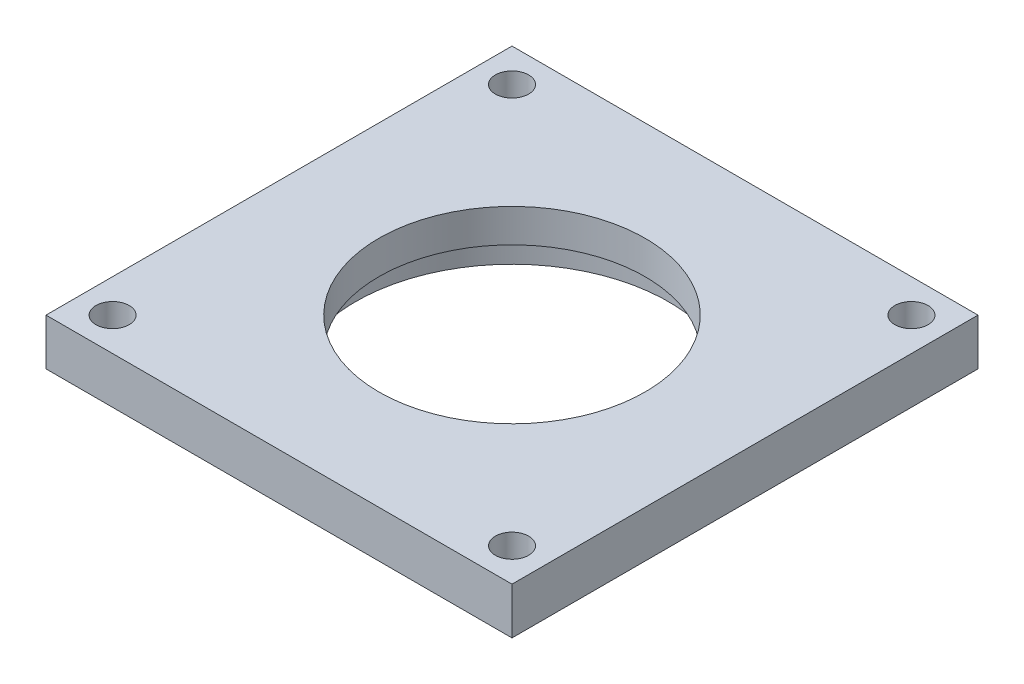
ISO-10303-21;
HEADER;
FILE_DESCRIPTION(('STEP AP214'),'2;1');
FILE_NAME('part.step','',(''),(''),'','','');
FILE_SCHEMA(('AUTOMOTIVE_DESIGN { 1 0 10303 214 1 1 1 1 }'));
ENDSEC;
DATA;
#1=APPLICATION_CONTEXT('core data for automotive mechanical design processes');
#2=APPLICATION_PROTOCOL_DEFINITION('international standard','automotive_design',2000,#1);
#3=PRODUCT_CONTEXT('',#1,'mechanical');
#4=PRODUCT('Part','Part','',(#3));
#5=PRODUCT_RELATED_PRODUCT_CATEGORY('part','',(#4));
#6=PRODUCT_DEFINITION_FORMATION('','',#4);
#7=PRODUCT_DEFINITION_CONTEXT('part definition',#1,'design');
#8=PRODUCT_DEFINITION('design','',#6,#7);
#9=PRODUCT_DEFINITION_SHAPE('','',#8);
#10=(LENGTH_UNIT() NAMED_UNIT(*) SI_UNIT(.MILLI.,.METRE.));
#11=(NAMED_UNIT(*) PLANE_ANGLE_UNIT() SI_UNIT($,.RADIAN.));
#12=(NAMED_UNIT(*) SI_UNIT($,.STERADIAN.) SOLID_ANGLE_UNIT());
#13=UNCERTAINTY_MEASURE_WITH_UNIT(LENGTH_MEASURE(1.E-05),#10,'distance_accuracy_value','');
#14=(GEOMETRIC_REPRESENTATION_CONTEXT(3) GLOBAL_UNCERTAINTY_ASSIGNED_CONTEXT((#13)) GLOBAL_UNIT_ASSIGNED_CONTEXT((#10,
#11,#12)) REPRESENTATION_CONTEXT('',''));
#15=CARTESIAN_POINT('',(0.,0.,0.));
#16=DIRECTION('',(0.,0.,1.));
#17=DIRECTION('',(1.,0.,0.));
#18=AXIS2_PLACEMENT_3D('',#15,#16,#17);
#19=CARTESIAN_POINT('',(0.,0.,0.));
#20=DIRECTION('',(0.,1.,0.));
#21=DIRECTION('',(0.,0.,1.));
#22=AXIS2_PLACEMENT_3D('',#19,#20,#21);
#23=PLANE('',#22);
#24=CARTESIAN_POINT('',(35.,0.,-35.));
#25=DIRECTION('',(0.,1.,0.));
#26=DIRECTION('',(0.,0.,1.));
#27=AXIS2_PLACEMENT_3D('',#24,#25,#26);
#28=CIRCLE('',#27,23.5);
#29=CARTESIAN_POINT('',(35.,0.,-11.5));
#30=VERTEX_POINT('',#29);
#31=EDGE_CURVE('E448',#30,#30,#28,.T.);
#32=ORIENTED_EDGE('',*,*,#31,.T.);
#33=EDGE_LOOP('',(#32));
#34=FACE_BOUND('',#33,.T.);
#35=DIRECTION('',(0.,0.,-1.));
#36=VECTOR('',#35,1.);
#37=CARTESIAN_POINT('',(5.00000000000001,0.,0.));
#38=LINE('',#37,#36);
#39=CARTESIAN_POINT('',(5.,0.,-15.0000000000001));
#40=VERTEX_POINT('',#39);
#41=CARTESIAN_POINT('',(5.,0.,-54.9999999999999));
#42=VERTEX_POINT('',#41);
#43=EDGE_CURVE('E58',#40,#42,#38,.T.);
#44=ORIENTED_EDGE('',*,*,#43,.T.);
#45=CARTESIAN_POINT('',(15.,0.,-55.));
#46=DIRECTION('',(0.,1.,0.));
#47=DIRECTION('',(0.,0.,1.));
#48=AXIS2_PLACEMENT_3D('',#45,#46,#47);
#49=CIRCLE('',#48,10.);
#50=CARTESIAN_POINT('',(15.0000000000001,0.,-65.));
#51=VERTEX_POINT('',#50);
#52=EDGE_CURVE('E209',#42,#51,#49,.F.);
#53=ORIENTED_EDGE('',*,*,#52,.T.);
#54=DIRECTION('',(1.,0.,0.));
#55=VECTOR('',#54,1.);
#56=CARTESIAN_POINT('',(0.,0.,-65.));
#57=LINE('',#56,#55);
#58=CARTESIAN_POINT('',(54.9999999999999,0.,-65.));
#59=VERTEX_POINT('',#58);
#60=EDGE_CURVE('E213',#51,#59,#57,.T.);
#61=ORIENTED_EDGE('',*,*,#60,.T.);
#62=CARTESIAN_POINT('',(55.,0.,-55.));
#63=DIRECTION('',(0.,1.,0.));
#64=DIRECTION('',(0.,0.,1.));
#65=AXIS2_PLACEMENT_3D('',#62,#63,#64);
#66=CIRCLE('',#65,10.);
#67=CARTESIAN_POINT('',(65.,0.,-54.9999999999999));
#68=VERTEX_POINT('',#67);
#69=EDGE_CURVE('E216',#59,#68,#66,.F.);
#70=ORIENTED_EDGE('',*,*,#69,.T.);
#71=DIRECTION('',(0.,0.,1.));
#72=VECTOR('',#71,1.);
#73=CARTESIAN_POINT('',(65.,0.,0.));
#74=LINE('',#73,#72);
#75=CARTESIAN_POINT('',(65.,0.,-15.0000000000001));
#76=VERTEX_POINT('',#75);
#77=EDGE_CURVE('E219',#68,#76,#74,.T.);
#78=ORIENTED_EDGE('',*,*,#77,.T.);
#79=CARTESIAN_POINT('',(55.,0.,-15.));
#80=DIRECTION('',(0.,1.,0.));
#81=DIRECTION('',(0.,0.,1.));
#82=AXIS2_PLACEMENT_3D('',#79,#80,#81);
#83=CIRCLE('',#82,10.);
#84=CARTESIAN_POINT('',(54.9999999999999,0.,-4.99999999999999));
#85=VERTEX_POINT('',#84);
#86=EDGE_CURVE('E222',#76,#85,#83,.F.);
#87=ORIENTED_EDGE('',*,*,#86,.T.);
#88=DIRECTION('',(-1.,0.,0.));
#89=VECTOR('',#88,1.);
#90=CARTESIAN_POINT('',(0.,0.,-4.99999999999999));
#91=LINE('',#90,#89);
#92=CARTESIAN_POINT('',(15.0000000000001,0.,-4.99999999999999));
#93=VERTEX_POINT('',#92);
#94=EDGE_CURVE('E225',#85,#93,#91,.T.);
#95=ORIENTED_EDGE('',*,*,#94,.T.);
#96=CARTESIAN_POINT('',(15.,0.,-15.));
#97=DIRECTION('',(0.,1.,0.));
#98=DIRECTION('',(0.,0.,1.));
#99=AXIS2_PLACEMENT_3D('',#96,#97,#98);
#100=CIRCLE('',#99,10.);
#101=EDGE_CURVE('E228',#93,#40,#100,.F.);
#102=ORIENTED_EDGE('',*,*,#101,.T.);
#103=EDGE_LOOP('',(#44,#53,#61,#70,#78,#87,#95,#102));
#104=FACE_BOUND('',#103,.T.);
#105=ADVANCED_FACE('F35',(#34,#104),#23,.F.);
#106=CARTESIAN_POINT('',(0.,10.,0.));
#107=DIRECTION('',(0.,0.,-1.));
#108=DIRECTION('',(-1.,0.,0.));
#109=AXIS2_PLACEMENT_3D('',#106,#107,#108);
#110=PLANE('',#109);
#111=DIRECTION('',(0.,-1.,0.));
#112=VECTOR('',#111,1.);
#113=CARTESIAN_POINT('',(0.,10.,0.));
#114=LINE('',#113,#112);
#115=CARTESIAN_POINT('',(0.,10.,0.));
#116=VERTEX_POINT('',#115);
#117=CARTESIAN_POINT('',(0.,3.,0.));
#118=VERTEX_POINT('',#117);
#119=EDGE_CURVE('E138',#116,#118,#114,.T.);
#120=ORIENTED_EDGE('',*,*,#119,.T.);
#121=DIRECTION('',(1.,0.,0.));
#122=VECTOR('',#121,1.);
#123=CARTESIAN_POINT('',(0.,3.,0.));
#124=LINE('',#123,#122);
#125=CARTESIAN_POINT('',(70.,3.,0.));
#126=VERTEX_POINT('',#125);
#127=EDGE_CURVE('E50',#118,#126,#124,.T.);
#128=ORIENTED_EDGE('',*,*,#127,.T.);
#129=DIRECTION('',(0.,-1.,0.));
#130=VECTOR('',#129,1.);
#131=CARTESIAN_POINT('',(70.,10.,0.));
#132=LINE('',#131,#130);
#133=CARTESIAN_POINT('',(70.,10.,0.));
#134=VERTEX_POINT('',#133);
#135=EDGE_CURVE('E11',#134,#126,#132,.T.);
#136=ORIENTED_EDGE('',*,*,#135,.F.);
#137=DIRECTION('',(1.,0.,0.));
#138=VECTOR('',#137,1.);
#139=CARTESIAN_POINT('',(0.,10.,0.));
#140=LINE('',#139,#138);
#141=EDGE_CURVE('E148',#116,#134,#140,.T.);
#142=ORIENTED_EDGE('',*,*,#141,.F.);
#143=EDGE_LOOP('',(#120,#128,#136,#142));
#144=FACE_BOUND('',#143,.T.);
#145=ADVANCED_FACE('F136',(#144),#110,.F.);
#146=CARTESIAN_POINT('',(70.,10.,0.));
#147=DIRECTION('',(-1.,0.,0.));
#148=DIRECTION('',(0.,0.,1.));
#149=AXIS2_PLACEMENT_3D('',#146,#147,#148);
#150=PLANE('',#149);
#151=ORIENTED_EDGE('',*,*,#135,.T.);
#152=DIRECTION('',(0.,0.,-1.));
#153=VECTOR('',#152,1.);
#154=CARTESIAN_POINT('',(70.,3.,0.));
#155=LINE('',#154,#153);
#156=CARTESIAN_POINT('',(70.,3.,-70.));
#157=VERTEX_POINT('',#156);
#158=EDGE_CURVE('E124',#126,#157,#155,.T.);
#159=ORIENTED_EDGE('',*,*,#158,.T.);
#160=DIRECTION('',(0.,-1.,0.));
#161=VECTOR('',#160,1.);
#162=CARTESIAN_POINT('',(70.,10.,-70.));
#163=LINE('',#162,#161);
#164=CARTESIAN_POINT('',(70.,10.,-70.));
#165=VERTEX_POINT('',#164);
#166=EDGE_CURVE('E43',#165,#157,#163,.T.);
#167=ORIENTED_EDGE('',*,*,#166,.F.);
#168=DIRECTION('',(0.,0.,-1.));
#169=VECTOR('',#168,1.);
#170=CARTESIAN_POINT('',(70.,10.,0.));
#171=LINE('',#170,#169);
#172=EDGE_CURVE('E142',#134,#165,#171,.T.);
#173=ORIENTED_EDGE('',*,*,#172,.F.);
#174=EDGE_LOOP('',(#151,#159,#167,#173));
#175=FACE_BOUND('',#174,.T.);
#176=ADVANCED_FACE('F141',(#175),#150,.F.);
#177=CARTESIAN_POINT('',(0.,10.,-70.));
#178=DIRECTION('',(0.,0.,-1.));
#179=DIRECTION('',(-1.,0.,0.));
#180=AXIS2_PLACEMENT_3D('',#177,#178,#179);
#181=PLANE('',#180);
#182=DIRECTION('',(1.,0.,0.));
#183=VECTOR('',#182,1.);
#184=CARTESIAN_POINT('',(0.,3.,-70.));
#185=LINE('',#184,#183);
#186=CARTESIAN_POINT('',(0.,3.,-70.));
#187=VERTEX_POINT('',#186);
#188=EDGE_CURVE('E128',#187,#157,#185,.T.);
#189=ORIENTED_EDGE('',*,*,#188,.F.);
#190=DIRECTION('',(0.,-1.,0.));
#191=VECTOR('',#190,1.);
#192=CARTESIAN_POINT('',(0.,10.,-70.));
#193=LINE('',#192,#191);
#194=CARTESIAN_POINT('',(0.,10.,-70.));
#195=VERTEX_POINT('',#194);
#196=EDGE_CURVE('E174',#195,#187,#193,.T.);
#197=ORIENTED_EDGE('',*,*,#196,.F.);
#198=DIRECTION('',(1.,0.,0.));
#199=VECTOR('',#198,1.);
#200=CARTESIAN_POINT('',(0.,10.,-70.));
#201=LINE('',#200,#199);
#202=EDGE_CURVE('E147',#195,#165,#201,.T.);
#203=ORIENTED_EDGE('',*,*,#202,.T.);
#204=ORIENTED_EDGE('',*,*,#166,.T.);
#205=EDGE_LOOP('',(#189,#197,#203,#204));
#206=FACE_BOUND('',#205,.T.);
#207=ADVANCED_FACE('F177',(#206),#181,.T.);
#208=CARTESIAN_POINT('',(5.,10.,-65.));
#209=DIRECTION('',(0.,-1.,0.));
#210=DIRECTION('',(0.,0.,-1.));
#211=AXIS2_PLACEMENT_3D('',#208,#209,#210);
#212=CYLINDRICAL_SURFACE('',#211,2.5);
#213=CARTESIAN_POINT('',(5.,3.,-65.));
#214=DIRECTION('',(0.,1.,0.));
#215=DIRECTION('',(0.,0.,1.));
#216=AXIS2_PLACEMENT_3D('',#213,#214,#215);
#217=CIRCLE('',#216,2.5);
#218=CARTESIAN_POINT('',(5.,3.,-62.5));
#219=VERTEX_POINT('',#218);
#220=EDGE_CURVE('E204',#219,#219,#217,.F.);
#221=ORIENTED_EDGE('',*,*,#220,.T.);
#222=EDGE_LOOP('',(#221));
#223=FACE_BOUND('',#222,.T.);
#224=CARTESIAN_POINT('',(5.,10.,-65.));
#225=DIRECTION('',(0.,1.,0.));
#226=DIRECTION('',(0.,0.,1.));
#227=AXIS2_PLACEMENT_3D('',#224,#225,#226);
#228=CIRCLE('',#227,2.5);
#229=CARTESIAN_POINT('',(5.,10.,-62.5));
#230=VERTEX_POINT('',#229);
#231=EDGE_CURVE('E167',#230,#230,#228,.F.);
#232=ORIENTED_EDGE('',*,*,#231,.F.);
#233=EDGE_LOOP('',(#232));
#234=FACE_BOUND('',#233,.T.);
#235=ADVANCED_FACE('F275',(#223,#234),#212,.F.);
#236=CARTESIAN_POINT('',(65.,10.,-65.));
#237=DIRECTION('',(0.,-1.,0.));
#238=DIRECTION('',(0.,0.,-1.));
#239=AXIS2_PLACEMENT_3D('',#236,#237,#238);
#240=CYLINDRICAL_SURFACE('',#239,2.5);
#241=CARTESIAN_POINT('',(65.,3.,-65.));
#242=DIRECTION('',(0.,1.,0.));
#243=DIRECTION('',(0.,0.,1.));
#244=AXIS2_PLACEMENT_3D('',#241,#242,#243);
#245=CIRCLE('',#244,2.5);
#246=CARTESIAN_POINT('',(65.,3.,-62.5));
#247=VERTEX_POINT('',#246);
#248=EDGE_CURVE('E201',#247,#247,#245,.T.);
#249=ORIENTED_EDGE('',*,*,#248,.F.);
#250=EDGE_LOOP('',(#249));
#251=FACE_BOUND('',#250,.T.);
#252=CARTESIAN_POINT('',(65.,10.,-65.));
#253=DIRECTION('',(0.,1.,0.));
#254=DIRECTION('',(0.,0.,1.));
#255=AXIS2_PLACEMENT_3D('',#252,#253,#254);
#256=CIRCLE('',#255,2.5);
#257=CARTESIAN_POINT('',(65.,10.,-62.5));
#258=VERTEX_POINT('',#257);
#259=EDGE_CURVE('E164',#258,#258,#256,.T.);
#260=ORIENTED_EDGE('',*,*,#259,.T.);
#261=EDGE_LOOP('',(#260));
#262=FACE_BOUND('',#261,.T.);
#263=ADVANCED_FACE('F278',(#251,#262),#240,.F.);
#264=CARTESIAN_POINT('',(0.,10.,0.));
#265=DIRECTION('',(-1.,0.,0.));
#266=DIRECTION('',(0.,0.,1.));
#267=AXIS2_PLACEMENT_3D('',#264,#265,#266);
#268=PLANE('',#267);
#269=DIRECTION('',(0.,0.,-1.));
#270=VECTOR('',#269,1.);
#271=CARTESIAN_POINT('',(0.,3.,0.));
#272=LINE('',#271,#270);
#273=EDGE_CURVE('E180',#118,#187,#272,.T.);
#274=ORIENTED_EDGE('',*,*,#273,.F.);
#275=ORIENTED_EDGE('',*,*,#119,.F.);
#276=DIRECTION('',(0.,0.,-1.));
#277=VECTOR('',#276,1.);
#278=CARTESIAN_POINT('',(0.,10.,0.));
#279=LINE('',#278,#277);
#280=EDGE_CURVE('E154',#116,#195,#279,.T.);
#281=ORIENTED_EDGE('',*,*,#280,.T.);
#282=ORIENTED_EDGE('',*,*,#196,.T.);
#283=EDGE_LOOP('',(#274,#275,#281,#282));
#284=FACE_BOUND('',#283,.T.);
#285=ADVANCED_FACE('F179',(#284),#268,.T.);
#286=CARTESIAN_POINT('',(5.00000000000001,10.,-4.99999999999999));
#287=DIRECTION('',(0.,-1.,0.));
#288=DIRECTION('',(0.,0.,-1.));
#289=AXIS2_PLACEMENT_3D('',#286,#287,#288);
#290=CYLINDRICAL_SURFACE('',#289,2.5);
#291=CARTESIAN_POINT('',(5.00000000000001,3.,-4.99999999999999));
#292=DIRECTION('',(0.,1.,0.));
#293=DIRECTION('',(0.,0.,1.));
#294=AXIS2_PLACEMENT_3D('',#291,#292,#293);
#295=CIRCLE('',#294,2.5);
#296=CARTESIAN_POINT('',(5.00000000000001,3.,-2.49999999999999));
#297=VERTEX_POINT('',#296);
#298=EDGE_CURVE('E139',#297,#297,#295,.T.);
#299=ORIENTED_EDGE('',*,*,#298,.F.);
#300=EDGE_LOOP('',(#299));
#301=FACE_BOUND('',#300,.T.);
#302=CARTESIAN_POINT('',(5.00000000000001,10.,-4.99999999999999));
#303=DIRECTION('',(0.,1.,0.));
#304=DIRECTION('',(0.,0.,1.));
#305=AXIS2_PLACEMENT_3D('',#302,#303,#304);
#306=CIRCLE('',#305,2.5);
#307=CARTESIAN_POINT('',(5.00000000000001,10.,-2.49999999999999));
#308=VERTEX_POINT('',#307);
#309=EDGE_CURVE('E155',#308,#308,#306,.T.);
#310=ORIENTED_EDGE('',*,*,#309,.T.);
#311=EDGE_LOOP('',(#310));
#312=FACE_BOUND('',#311,.T.);
#313=ADVANCED_FACE('F253',(#301,#312),#290,.F.);
#314=CARTESIAN_POINT('',(65.,10.,-5.));
#315=DIRECTION('',(0.,-1.,0.));
#316=DIRECTION('',(0.,0.,-1.));
#317=AXIS2_PLACEMENT_3D('',#314,#315,#316);
#318=CYLINDRICAL_SURFACE('',#317,2.49999999999999);
#319=CARTESIAN_POINT('',(65.,3.,-5.));
#320=DIRECTION('',(0.,1.,0.));
#321=DIRECTION('',(0.,0.,1.));
#322=AXIS2_PLACEMENT_3D('',#319,#320,#321);
#323=CIRCLE('',#322,2.49999999999999);
#324=CARTESIAN_POINT('',(65.,3.,-2.5));
#325=VERTEX_POINT('',#324);
#326=EDGE_CURVE('E231',#325,#325,#323,.F.);
#327=ORIENTED_EDGE('',*,*,#326,.T.);
#328=EDGE_LOOP('',(#327));
#329=FACE_BOUND('',#328,.T.);
#330=CARTESIAN_POINT('',(65.,10.,-5.));
#331=DIRECTION('',(0.,1.,0.));
#332=DIRECTION('',(0.,0.,1.));
#333=AXIS2_PLACEMENT_3D('',#330,#331,#332);
#334=CIRCLE('',#333,2.49999999999999);
#335=CARTESIAN_POINT('',(65.,10.,-2.5));
#336=VERTEX_POINT('',#335);
#337=EDGE_CURVE('E158',#336,#336,#334,.F.);
#338=ORIENTED_EDGE('',*,*,#337,.F.);
#339=EDGE_LOOP('',(#338));
#340=FACE_BOUND('',#339,.T.);
#341=ADVANCED_FACE('F37',(#329,#340),#318,.F.);
#342=CARTESIAN_POINT('',(35.,10.,-35.));
#343=DIRECTION('',(0.,-1.,0.));
#344=DIRECTION('',(0.,0.,-1.));
#345=AXIS2_PLACEMENT_3D('',#342,#343,#344);
#346=CYLINDRICAL_SURFACE('',#345,20.);
#347=CARTESIAN_POINT('',(35.,5.,-35.));
#348=DIRECTION('',(0.,1.,0.));
#349=DIRECTION('',(0.,0.,1.));
#350=AXIS2_PLACEMENT_3D('',#347,#348,#349);
#351=CIRCLE('',#350,20.);
#352=CARTESIAN_POINT('',(35.,5.,-15.));
#353=VERTEX_POINT('',#352);
#354=EDGE_CURVE('E444',#353,#353,#351,.T.);
#355=ORIENTED_EDGE('',*,*,#354,.F.);
#356=EDGE_LOOP('',(#355));
#357=FACE_BOUND('',#356,.T.);
#358=CARTESIAN_POINT('',(35.,10.,-35.));
#359=DIRECTION('',(0.,1.,0.));
#360=DIRECTION('',(0.,0.,1.));
#361=AXIS2_PLACEMENT_3D('',#358,#359,#360);
#362=CIRCLE('',#361,20.);
#363=CARTESIAN_POINT('',(35.,10.,-15.));
#364=VERTEX_POINT('',#363);
#365=EDGE_CURVE('E170',#364,#364,#362,.T.);
#366=ORIENTED_EDGE('',*,*,#365,.T.);
#367=EDGE_LOOP('',(#366));
#368=FACE_BOUND('',#367,.T.);
#369=ADVANCED_FACE('F252',(#357,#368),#346,.F.);
#370=CARTESIAN_POINT('',(0.,10.,0.));
#371=DIRECTION('',(0.,1.,0.));
#372=DIRECTION('',(0.,0.,1.));
#373=AXIS2_PLACEMENT_3D('',#370,#371,#372);
#374=PLANE('',#373);
#375=ORIENTED_EDGE('',*,*,#337,.T.);
#376=EDGE_LOOP('',(#375));
#377=FACE_BOUND('',#376,.T.);
#378=ORIENTED_EDGE('',*,*,#309,.F.);
#379=EDGE_LOOP('',(#378));
#380=FACE_BOUND('',#379,.T.);
#381=ORIENTED_EDGE('',*,*,#141,.T.);
#382=ORIENTED_EDGE('',*,*,#172,.T.);
#383=ORIENTED_EDGE('',*,*,#202,.F.);
#384=ORIENTED_EDGE('',*,*,#280,.F.);
#385=EDGE_LOOP('',(#381,#382,#383,#384));
#386=FACE_BOUND('',#385,.T.);
#387=ORIENTED_EDGE('',*,*,#259,.F.);
#388=EDGE_LOOP('',(#387));
#389=FACE_BOUND('',#388,.T.);
#390=ORIENTED_EDGE('',*,*,#231,.T.);
#391=EDGE_LOOP('',(#390));
#392=FACE_BOUND('',#391,.T.);
#393=ORIENTED_EDGE('',*,*,#365,.F.);
#394=EDGE_LOOP('',(#393));
#395=FACE_BOUND('',#394,.T.);
#396=ADVANCED_FACE('F151',(#377,#380,#386,#389,#392,#395),#374,.T.);
#397=CARTESIAN_POINT('',(5.00000000000001,3.,0.));
#398=DIRECTION('',(-1.,0.,0.));
#399=DIRECTION('',(0.,0.,1.));
#400=AXIS2_PLACEMENT_3D('',#397,#398,#399);
#401=PLANE('',#400);
#402=ORIENTED_EDGE('',*,*,#43,.F.);
#403=DIRECTION('',(0.,-1.,0.));
#404=VECTOR('',#403,1.);
#405=CARTESIAN_POINT('',(5.,3.,-15.0000000000001));
#406=LINE('',#405,#404);
#407=CARTESIAN_POINT('',(5.,3.,-15.0000000000001));
#408=VERTEX_POINT('',#407);
#409=EDGE_CURVE('E207',#408,#40,#406,.T.);
#410=ORIENTED_EDGE('',*,*,#409,.F.);
#411=DIRECTION('',(0.,0.,-1.));
#412=VECTOR('',#411,1.);
#413=CARTESIAN_POINT('',(5.00000000000001,3.,0.));
#414=LINE('',#413,#412);
#415=CARTESIAN_POINT('',(5.,3.,-54.9999999999999));
#416=VERTEX_POINT('',#415);
#417=EDGE_CURVE('E181',#408,#416,#414,.T.);
#418=ORIENTED_EDGE('',*,*,#417,.T.);
#419=DIRECTION('',(0.,-1.,0.));
#420=VECTOR('',#419,1.);
#421=CARTESIAN_POINT('',(5.,3.,-54.9999999999999));
#422=LINE('',#421,#420);
#423=EDGE_CURVE('E245',#416,#42,#422,.T.);
#424=ORIENTED_EDGE('',*,*,#423,.T.);
#425=EDGE_LOOP('',(#402,#410,#418,#424));
#426=FACE_BOUND('',#425,.T.);
#427=ADVANCED_FACE('F322',(#426),#401,.T.);
#428=CARTESIAN_POINT('',(15.,3.,-55.));
#429=DIRECTION('',(0.,-1.,0.));
#430=DIRECTION('',(0.,0.,-1.));
#431=AXIS2_PLACEMENT_3D('',#428,#429,#430);
#432=CYLINDRICAL_SURFACE('',#431,10.);
#433=ORIENTED_EDGE('',*,*,#52,.F.);
#434=ORIENTED_EDGE('',*,*,#423,.F.);
#435=CARTESIAN_POINT('',(15.,3.,-55.));
#436=DIRECTION('',(0.,1.,0.));
#437=DIRECTION('',(0.,0.,1.));
#438=AXIS2_PLACEMENT_3D('',#435,#436,#437);
#439=CIRCLE('',#438,10.);
#440=CARTESIAN_POINT('',(15.0000000000001,3.,-65.));
#441=VERTEX_POINT('',#440);
#442=EDGE_CURVE('E184',#416,#441,#439,.F.);
#443=ORIENTED_EDGE('',*,*,#442,.T.);
#444=DIRECTION('',(0.,-1.,0.));
#445=VECTOR('',#444,1.);
#446=CARTESIAN_POINT('',(15.0000000000001,3.,-65.));
#447=LINE('',#446,#445);
#448=EDGE_CURVE('E243',#441,#51,#447,.T.);
#449=ORIENTED_EDGE('',*,*,#448,.T.);
#450=EDGE_LOOP('',(#433,#434,#443,#449));
#451=FACE_BOUND('',#450,.T.);
#452=ADVANCED_FACE('F327',(#451),#432,.T.);
#453=CARTESIAN_POINT('',(0.,3.,-65.));
#454=DIRECTION('',(0.,0.,-1.));
#455=DIRECTION('',(-1.,0.,0.));
#456=AXIS2_PLACEMENT_3D('',#453,#454,#455);
#457=PLANE('',#456);
#458=ORIENTED_EDGE('',*,*,#60,.F.);
#459=ORIENTED_EDGE('',*,*,#448,.F.);
#460=DIRECTION('',(1.,0.,0.));
#461=VECTOR('',#460,1.);
#462=CARTESIAN_POINT('',(0.,3.,-65.));
#463=LINE('',#462,#461);
#464=CARTESIAN_POINT('',(54.9999999999999,3.,-65.));
#465=VERTEX_POINT('',#464);
#466=EDGE_CURVE('E189',#441,#465,#463,.T.);
#467=ORIENTED_EDGE('',*,*,#466,.T.);
#468=DIRECTION('',(0.,-1.,0.));
#469=VECTOR('',#468,1.);
#470=CARTESIAN_POINT('',(54.9999999999999,3.,-65.));
#471=LINE('',#470,#469);
#472=EDGE_CURVE('E241',#465,#59,#471,.T.);
#473=ORIENTED_EDGE('',*,*,#472,.T.);
#474=EDGE_LOOP('',(#458,#459,#467,#473));
#475=FACE_BOUND('',#474,.T.);
#476=ADVANCED_FACE('F337',(#475),#457,.T.);
#477=CARTESIAN_POINT('',(55.,3.,-55.));
#478=DIRECTION('',(0.,-1.,0.));
#479=DIRECTION('',(0.,0.,-1.));
#480=AXIS2_PLACEMENT_3D('',#477,#478,#479);
#481=CYLINDRICAL_SURFACE('',#480,10.);
#482=ORIENTED_EDGE('',*,*,#69,.F.);
#483=ORIENTED_EDGE('',*,*,#472,.F.);
#484=CARTESIAN_POINT('',(55.,3.,-55.));
#485=DIRECTION('',(0.,1.,0.));
#486=DIRECTION('',(0.,0.,1.));
#487=AXIS2_PLACEMENT_3D('',#484,#485,#486);
#488=CIRCLE('',#487,10.);
#489=CARTESIAN_POINT('',(65.,3.,-54.9999999999999));
#490=VERTEX_POINT('',#489);
#491=EDGE_CURVE('E191',#465,#490,#488,.F.);
#492=ORIENTED_EDGE('',*,*,#491,.T.);
#493=DIRECTION('',(0.,-1.,0.));
#494=VECTOR('',#493,1.);
#495=CARTESIAN_POINT('',(65.,3.,-54.9999999999999));
#496=LINE('',#495,#494);
#497=EDGE_CURVE('E239',#490,#68,#496,.T.);
#498=ORIENTED_EDGE('',*,*,#497,.T.);
#499=EDGE_LOOP('',(#482,#483,#492,#498));
#500=FACE_BOUND('',#499,.T.);
#501=ADVANCED_FACE('F347',(#500),#481,.T.);
#502=CARTESIAN_POINT('',(65.,3.,0.));
#503=DIRECTION('',(1.,0.,0.));
#504=DIRECTION('',(0.,0.,-1.));
#505=AXIS2_PLACEMENT_3D('',#502,#503,#504);
#506=PLANE('',#505);
#507=ORIENTED_EDGE('',*,*,#77,.F.);
#508=ORIENTED_EDGE('',*,*,#497,.F.);
#509=DIRECTION('',(0.,0.,1.));
#510=VECTOR('',#509,1.);
#511=CARTESIAN_POINT('',(65.,3.,0.));
#512=LINE('',#511,#510);
#513=CARTESIAN_POINT('',(65.,3.,-15.0000000000001));
#514=VERTEX_POINT('',#513);
#515=EDGE_CURVE('E193',#490,#514,#512,.T.);
#516=ORIENTED_EDGE('',*,*,#515,.T.);
#517=DIRECTION('',(0.,-1.,0.));
#518=VECTOR('',#517,1.);
#519=CARTESIAN_POINT('',(65.,3.,-15.0000000000001));
#520=LINE('',#519,#518);
#521=EDGE_CURVE('E237',#514,#76,#520,.T.);
#522=ORIENTED_EDGE('',*,*,#521,.T.);
#523=EDGE_LOOP('',(#507,#508,#516,#522));
#524=FACE_BOUND('',#523,.T.);
#525=ADVANCED_FACE('F357',(#524),#506,.T.);
#526=CARTESIAN_POINT('',(55.,3.,-15.));
#527=DIRECTION('',(0.,-1.,0.));
#528=DIRECTION('',(0.,0.,-1.));
#529=AXIS2_PLACEMENT_3D('',#526,#527,#528);
#530=CYLINDRICAL_SURFACE('',#529,10.);
#531=ORIENTED_EDGE('',*,*,#86,.F.);
#532=ORIENTED_EDGE('',*,*,#521,.F.);
#533=CARTESIAN_POINT('',(55.,3.,-15.));
#534=DIRECTION('',(0.,1.,0.));
#535=DIRECTION('',(0.,0.,1.));
#536=AXIS2_PLACEMENT_3D('',#533,#534,#535);
#537=CIRCLE('',#536,10.);
#538=CARTESIAN_POINT('',(54.9999999999999,3.,-4.99999999999999));
#539=VERTEX_POINT('',#538);
#540=EDGE_CURVE('E195',#514,#539,#537,.F.);
#541=ORIENTED_EDGE('',*,*,#540,.T.);
#542=DIRECTION('',(0.,-1.,0.));
#543=VECTOR('',#542,1.);
#544=CARTESIAN_POINT('',(54.9999999999999,3.,-4.99999999999999));
#545=LINE('',#544,#543);
#546=EDGE_CURVE('E235',#539,#85,#545,.T.);
#547=ORIENTED_EDGE('',*,*,#546,.T.);
#548=EDGE_LOOP('',(#531,#532,#541,#547));
#549=FACE_BOUND('',#548,.T.);
#550=ADVANCED_FACE('F367',(#549),#530,.T.);
#551=CARTESIAN_POINT('',(0.,3.,-4.99999999999999));
#552=DIRECTION('',(0.,0.,1.));
#553=DIRECTION('',(1.,0.,0.));
#554=AXIS2_PLACEMENT_3D('',#551,#552,#553);
#555=PLANE('',#554);
#556=ORIENTED_EDGE('',*,*,#94,.F.);
#557=ORIENTED_EDGE('',*,*,#546,.F.);
#558=DIRECTION('',(-1.,0.,0.));
#559=VECTOR('',#558,1.);
#560=CARTESIAN_POINT('',(0.,3.,-4.99999999999999));
#561=LINE('',#560,#559);
#562=CARTESIAN_POINT('',(15.0000000000001,3.,-4.99999999999999));
#563=VERTEX_POINT('',#562);
#564=EDGE_CURVE('E197',#539,#563,#561,.T.);
#565=ORIENTED_EDGE('',*,*,#564,.T.);
#566=DIRECTION('',(0.,-1.,0.));
#567=VECTOR('',#566,1.);
#568=CARTESIAN_POINT('',(15.0000000000001,3.,-4.99999999999999));
#569=LINE('',#568,#567);
#570=EDGE_CURVE('E233',#563,#93,#569,.T.);
#571=ORIENTED_EDGE('',*,*,#570,.T.);
#572=EDGE_LOOP('',(#556,#557,#565,#571));
#573=FACE_BOUND('',#572,.T.);
#574=ADVANCED_FACE('F377',(#573),#555,.T.);
#575=CARTESIAN_POINT('',(15.,3.,-15.));
#576=DIRECTION('',(0.,-1.,0.));
#577=DIRECTION('',(0.,0.,-1.));
#578=AXIS2_PLACEMENT_3D('',#575,#576,#577);
#579=CYLINDRICAL_SURFACE('',#578,10.);
#580=ORIENTED_EDGE('',*,*,#101,.F.);
#581=ORIENTED_EDGE('',*,*,#570,.F.);
#582=CARTESIAN_POINT('',(15.,3.,-15.));
#583=DIRECTION('',(0.,1.,0.));
#584=DIRECTION('',(0.,0.,1.));
#585=AXIS2_PLACEMENT_3D('',#582,#583,#584);
#586=CIRCLE('',#585,10.);
#587=EDGE_CURVE('E199',#563,#408,#586,.F.);
#588=ORIENTED_EDGE('',*,*,#587,.T.);
#589=ORIENTED_EDGE('',*,*,#409,.T.);
#590=EDGE_LOOP('',(#580,#581,#588,#589));
#591=FACE_BOUND('',#590,.T.);
#592=ADVANCED_FACE('F387',(#591),#579,.T.);
#593=CARTESIAN_POINT('',(0.,3.,0.));
#594=DIRECTION('',(0.,1.,0.));
#595=DIRECTION('',(0.,0.,1.));
#596=AXIS2_PLACEMENT_3D('',#593,#594,#595);
#597=PLANE('',#596);
#598=ORIENTED_EDGE('',*,*,#326,.F.);
#599=EDGE_LOOP('',(#598));
#600=FACE_BOUND('',#599,.T.);
#601=ORIENTED_EDGE('',*,*,#298,.T.);
#602=EDGE_LOOP('',(#601));
#603=FACE_BOUND('',#602,.T.);
#604=ORIENTED_EDGE('',*,*,#127,.F.);
#605=ORIENTED_EDGE('',*,*,#273,.T.);
#606=ORIENTED_EDGE('',*,*,#188,.T.);
#607=ORIENTED_EDGE('',*,*,#158,.F.);
#608=EDGE_LOOP('',(#604,#605,#606,#607));
#609=FACE_BOUND('',#608,.T.);
#610=ORIENTED_EDGE('',*,*,#417,.F.);
#611=ORIENTED_EDGE('',*,*,#587,.F.);
#612=ORIENTED_EDGE('',*,*,#564,.F.);
#613=ORIENTED_EDGE('',*,*,#540,.F.);
#614=ORIENTED_EDGE('',*,*,#515,.F.);
#615=ORIENTED_EDGE('',*,*,#491,.F.);
#616=ORIENTED_EDGE('',*,*,#466,.F.);
#617=ORIENTED_EDGE('',*,*,#442,.F.);
#618=EDGE_LOOP('',(#610,#611,#612,#613,#614,#615,#616,#617));
#619=FACE_BOUND('',#618,.T.);
#620=ORIENTED_EDGE('',*,*,#248,.T.);
#621=EDGE_LOOP('',(#620));
#622=FACE_BOUND('',#621,.T.);
#623=ORIENTED_EDGE('',*,*,#220,.F.);
#624=EDGE_LOOP('',(#623));
#625=FACE_BOUND('',#624,.T.);
#626=ADVANCED_FACE('F125',(#600,#603,#609,#619,#622,#625),#597,.F.);
#627=CARTESIAN_POINT('',(35.,5.,-35.));
#628=DIRECTION('',(0.,-1.,0.));
#629=DIRECTION('',(0.,0.,-1.));
#630=AXIS2_PLACEMENT_3D('',#627,#628,#629);
#631=CYLINDRICAL_SURFACE('',#630,23.5);
#632=CARTESIAN_POINT('',(35.,5.,-35.));
#633=DIRECTION('',(0.,1.,0.));
#634=DIRECTION('',(0.,0.,1.));
#635=AXIS2_PLACEMENT_3D('',#632,#633,#634);
#636=CIRCLE('',#635,23.5);
#637=CARTESIAN_POINT('',(35.,5.,-11.5));
#638=VERTEX_POINT('',#637);
#639=EDGE_CURVE('E210',#638,#638,#636,.T.);
#640=ORIENTED_EDGE('',*,*,#639,.T.);
#641=EDGE_LOOP('',(#640));
#642=FACE_BOUND('',#641,.T.);
#643=ORIENTED_EDGE('',*,*,#31,.F.);
#644=EDGE_LOOP('',(#643));
#645=FACE_BOUND('',#644,.T.);
#646=ADVANCED_FACE('F405',(#642,#645),#631,.F.);
#647=CARTESIAN_POINT('',(0.,5.,0.));
#648=DIRECTION('',(0.,1.,0.));
#649=DIRECTION('',(0.,0.,1.));
#650=AXIS2_PLACEMENT_3D('',#647,#648,#649);
#651=PLANE('',#650);
#652=ORIENTED_EDGE('',*,*,#354,.T.);
#653=EDGE_LOOP('',(#652));
#654=FACE_BOUND('',#653,.T.);
#655=ORIENTED_EDGE('',*,*,#639,.F.);
#656=EDGE_LOOP('',(#655));
#657=FACE_BOUND('',#656,.T.);
#658=ADVANCED_FACE('F427',(#654,#657),#651,.F.);
#659=CLOSED_SHELL('',(#105,#145,#176,#207,#235,#263,#285,#313,#341,#369,#396,#427,#452,#476,
#501,#525,#550,#574,#592,#626,#646,#658));
#660=MANIFOLD_SOLID_BREP('B2',#659);
#661=ADVANCED_BREP_SHAPE_REPRESENTATION('',(#18,#660),#14);
#662=SHAPE_DEFINITION_REPRESENTATION(#9,#661);
ENDSEC;
END-ISO-10303-21;
